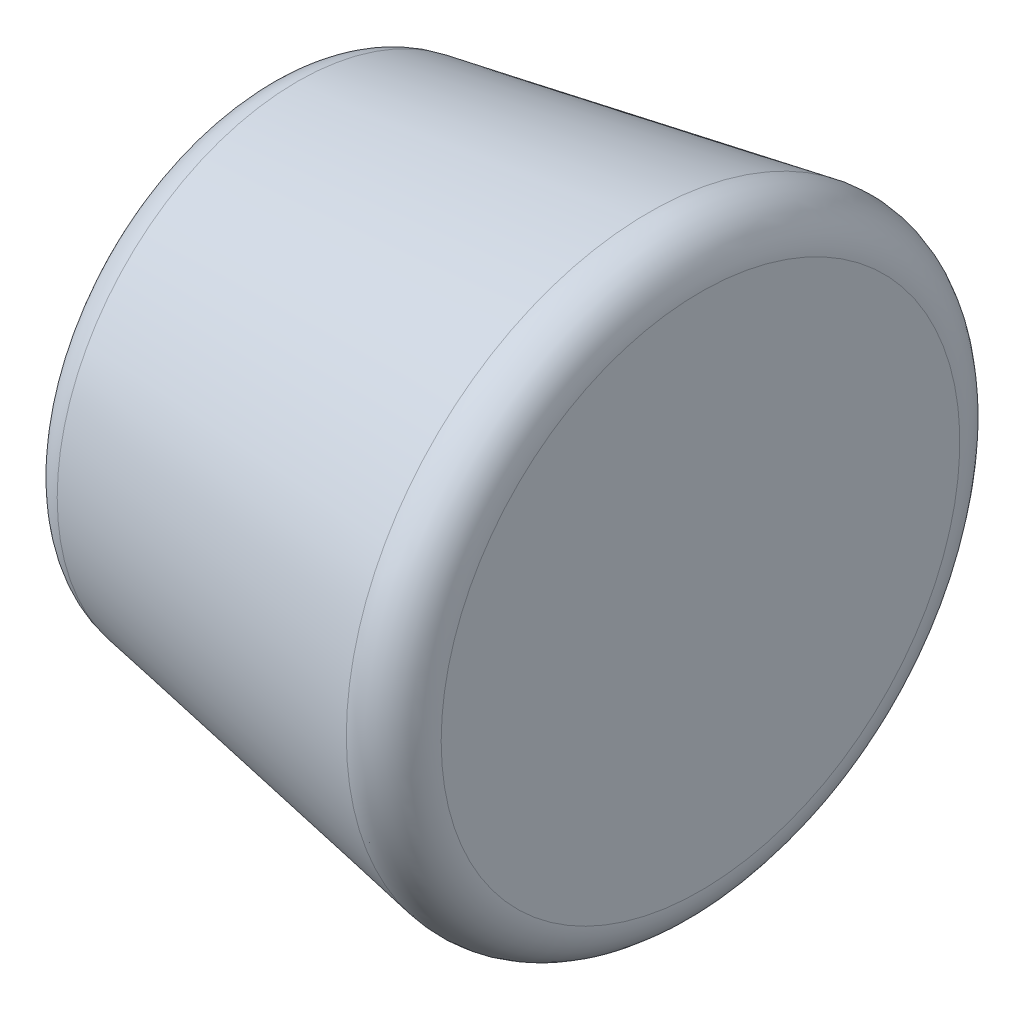
ISO-10303-21;
HEADER;
FILE_DESCRIPTION(('STEP AP214'),'2;1');
FILE_NAME('part.step','',(''),(''),'','','');
FILE_SCHEMA(('AUTOMOTIVE_DESIGN { 1 0 10303 214 1 1 1 1 }'));
ENDSEC;
DATA;
#1=APPLICATION_CONTEXT('core data for automotive mechanical design processes');
#2=APPLICATION_PROTOCOL_DEFINITION('international standard','automotive_design',2000,#1);
#3=PRODUCT_CONTEXT('',#1,'mechanical');
#4=PRODUCT('Part','Part','',(#3));
#5=PRODUCT_RELATED_PRODUCT_CATEGORY('part','',(#4));
#6=PRODUCT_DEFINITION_FORMATION('','',#4);
#7=PRODUCT_DEFINITION_CONTEXT('part definition',#1,'design');
#8=PRODUCT_DEFINITION('design','',#6,#7);
#9=PRODUCT_DEFINITION_SHAPE('','',#8);
#10=(LENGTH_UNIT() NAMED_UNIT(*) SI_UNIT(.MILLI.,.METRE.));
#11=(NAMED_UNIT(*) PLANE_ANGLE_UNIT() SI_UNIT($,.RADIAN.));
#12=(NAMED_UNIT(*) SI_UNIT($,.STERADIAN.) SOLID_ANGLE_UNIT());
#13=UNCERTAINTY_MEASURE_WITH_UNIT(LENGTH_MEASURE(1.E-05),#10,'distance_accuracy_value','');
#14=(GEOMETRIC_REPRESENTATION_CONTEXT(3) GLOBAL_UNCERTAINTY_ASSIGNED_CONTEXT((#13)) GLOBAL_UNIT_ASSIGNED_CONTEXT((#10,
#11,#12)) REPRESENTATION_CONTEXT('',''));
#15=CARTESIAN_POINT('',(0.,0.,0.));
#16=DIRECTION('',(0.,0.,1.));
#17=DIRECTION('',(1.,0.,0.));
#18=AXIS2_PLACEMENT_3D('',#15,#16,#17);
#19=CARTESIAN_POINT('',(10.,0.,0.));
#20=DIRECTION('',(-1.,0.,0.));
#21=DIRECTION('',(0.,0.,1.));
#22=AXIS2_PLACEMENT_3D('',#19,#20,#21);
#23=PLANE('',#22);
#24=CARTESIAN_POINT('',(10.,0.,0.));
#25=DIRECTION('',(-1.,0.,0.));
#26=DIRECTION('',(0.,0.,1.));
#27=AXIS2_PLACEMENT_3D('',#24,#25,#26);
#28=CIRCLE('',#27,5.90310397302864);
#29=CARTESIAN_POINT('',(10.,0.,5.90310397302864));
#30=VERTEX_POINT('',#29);
#31=EDGE_CURVE('E10',#30,#30,#28,.F.);
#32=ORIENTED_EDGE('',*,*,#31,.T.);
#33=EDGE_LOOP('',(#32));
#34=FACE_BOUND('',#33,.T.);
#35=ADVANCED_FACE('F44',(#34),#23,.F.);
#36=CARTESIAN_POINT('',(0.,0.,0.));
#37=DIRECTION('',(1.,0.,0.));
#38=DIRECTION('',(0.,0.,-1.));
#39=AXIS2_PLACEMENT_3D('',#36,#37,#38);
#40=CONICAL_SURFACE('',#39,5.323,0.175476447090876);
#41=CARTESIAN_POINT('',(0.82542271209082,0.,0.));
#42=DIRECTION('',(-1.,0.,0.));
#43=DIRECTION('',(0.,0.,1.));
#44=AXIS2_PLACEMENT_3D('',#41,#42,#43);
#45=CIRCLE('',#44,5.4693474468537);
#46=CARTESIAN_POINT('',(0.82542271209082,0.,5.4693474468537));
#47=VERTEX_POINT('',#46);
#48=EDGE_CURVE('E59',#47,#47,#45,.F.);
#49=ORIENTED_EDGE('',*,*,#48,.T.);
#50=EDGE_LOOP('',(#49));
#51=FACE_BOUND('',#50,.T.);
#52=CARTESIAN_POINT('',(8.82542271209082,0.,0.));
#53=DIRECTION('',(-1.,0.,0.));
#54=DIRECTION('',(0.,0.,1.));
#55=AXIS2_PLACEMENT_3D('',#52,#53,#54);
#56=CIRCLE('',#55,6.8877474468537);
#57=CARTESIAN_POINT('',(8.82542271209082,0.,6.8877474468537));
#58=VERTEX_POINT('',#57);
#59=EDGE_CURVE('E65',#58,#58,#56,.T.);
#60=ORIENTED_EDGE('',*,*,#59,.T.);
#61=EDGE_LOOP('',(#60));
#62=FACE_BOUND('',#61,.T.);
#63=ADVANCED_FACE('F69',(#51,#62),#40,.T.);
#64=CARTESIAN_POINT('',(0.,0.,0.));
#65=DIRECTION('',(1.,0.,0.));
#66=DIRECTION('',(0.,0.,-1.));
#67=AXIS2_PLACEMENT_3D('',#64,#65,#66);
#68=PLANE('',#67);
#69=CARTESIAN_POINT('',(0.,0.,0.));
#70=DIRECTION('',(1.,0.,0.));
#71=DIRECTION('',(0.,0.,-1.));
#72=AXIS2_PLACEMENT_3D('',#69,#70,#71);
#73=CIRCLE('',#72,4.48470397302865);
#74=CARTESIAN_POINT('',(0.,0.,-4.48470397302865));
#75=VERTEX_POINT('',#74);
#76=EDGE_CURVE('E52',#75,#75,#73,.F.);
#77=ORIENTED_EDGE('',*,*,#76,.T.);
#78=EDGE_LOOP('',(#77));
#79=FACE_BOUND('',#78,.T.);
#80=ADVANCED_FACE('F80',(#79),#68,.F.);
#81=CARTESIAN_POINT('',(1.,0.,0.));
#82=DIRECTION('',(1.,0.,0.));
#83=DIRECTION('',(0.,0.,-1.));
#84=AXIS2_PLACEMENT_3D('',#81,#82,#83);
#85=TOROIDAL_SURFACE('',#84,4.48470397302865,1.);
#86=ORIENTED_EDGE('',*,*,#76,.F.);
#87=EDGE_LOOP('',(#86));
#88=FACE_BOUND('',#87,.T.);
#89=ORIENTED_EDGE('',*,*,#48,.F.);
#90=EDGE_LOOP('',(#89));
#91=FACE_BOUND('',#90,.T.);
#92=ADVANCED_FACE('F74',(#88,#91),#85,.T.);
#93=CARTESIAN_POINT('',(9.,0.,0.));
#94=DIRECTION('',(-1.,0.,0.));
#95=DIRECTION('',(0.,0.,1.));
#96=AXIS2_PLACEMENT_3D('',#93,#94,#95);
#97=TOROIDAL_SURFACE('',#96,5.90310397302864,1.);
#98=ORIENTED_EDGE('',*,*,#59,.F.);
#99=EDGE_LOOP('',(#98));
#100=FACE_BOUND('',#99,.T.);
#101=ORIENTED_EDGE('',*,*,#31,.F.);
#102=EDGE_LOOP('',(#101));
#103=FACE_BOUND('',#102,.T.);
#104=ADVANCED_FACE('F50',(#100,#103),#97,.T.);
#105=CLOSED_SHELL('',(#35,#63,#80,#92,#104));
#106=MANIFOLD_SOLID_BREP('B2',#105);
#107=ADVANCED_BREP_SHAPE_REPRESENTATION('',(#18,#106),#14);
#108=SHAPE_DEFINITION_REPRESENTATION(#9,#107);
ENDSEC;
END-ISO-10303-21;
